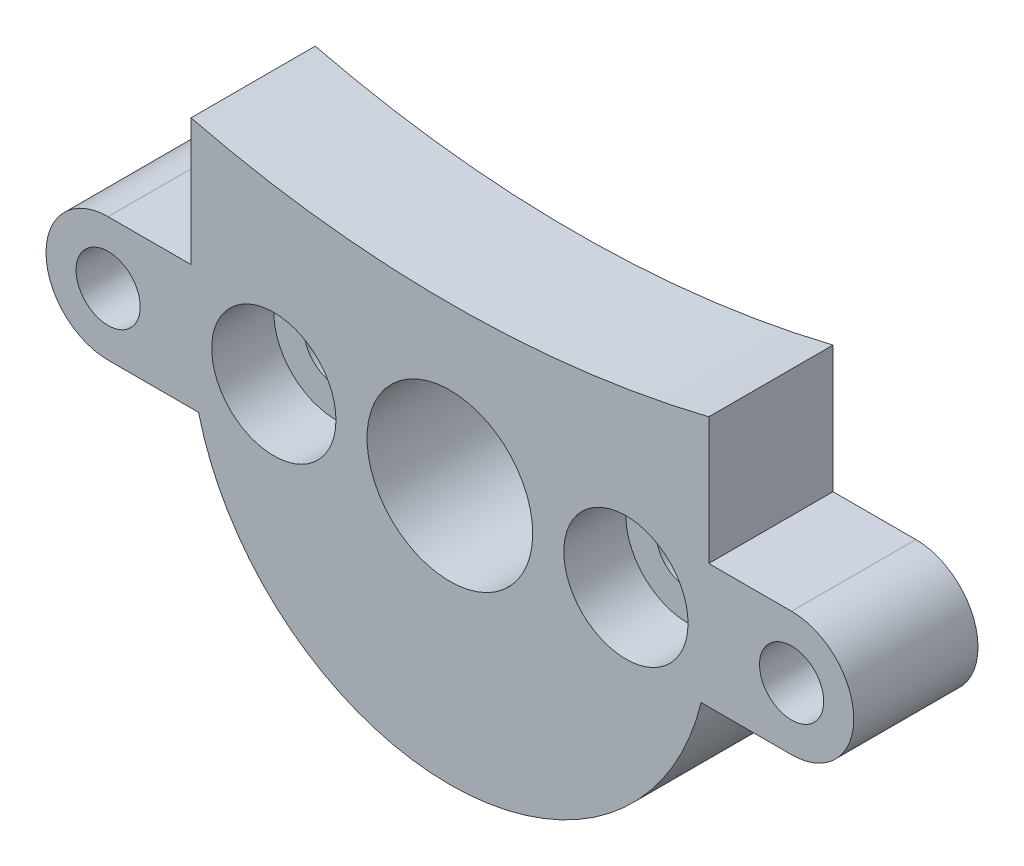
ISO-10303-21;
HEADER;
FILE_DESCRIPTION(('STEP AP214'),'2;1');
FILE_NAME('part.step','',(''),(''),'','','');
FILE_SCHEMA(('AUTOMOTIVE_DESIGN { 1 0 10303 214 1 1 1 1 }'));
ENDSEC;
DATA;
#1=APPLICATION_CONTEXT('core data for automotive mechanical design processes');
#2=APPLICATION_PROTOCOL_DEFINITION('international standard','automotive_design',2000,#1);
#3=PRODUCT_CONTEXT('',#1,'mechanical');
#4=PRODUCT('Part','Part','',(#3));
#5=PRODUCT_RELATED_PRODUCT_CATEGORY('part','',(#4));
#6=PRODUCT_DEFINITION_FORMATION('','',#4);
#7=PRODUCT_DEFINITION_CONTEXT('part definition',#1,'design');
#8=PRODUCT_DEFINITION('design','',#6,#7);
#9=PRODUCT_DEFINITION_SHAPE('','',#8);
#10=(LENGTH_UNIT() NAMED_UNIT(*) SI_UNIT(.MILLI.,.METRE.));
#11=(NAMED_UNIT(*) PLANE_ANGLE_UNIT() SI_UNIT($,.RADIAN.));
#12=(NAMED_UNIT(*) SI_UNIT($,.STERADIAN.) SOLID_ANGLE_UNIT());
#13=UNCERTAINTY_MEASURE_WITH_UNIT(LENGTH_MEASURE(1.E-05),#10,'distance_accuracy_value','');
#14=(GEOMETRIC_REPRESENTATION_CONTEXT(3) GLOBAL_UNCERTAINTY_ASSIGNED_CONTEXT((#13)) GLOBAL_UNIT_ASSIGNED_CONTEXT((#10,
#11,#12)) REPRESENTATION_CONTEXT('',''));
#15=CARTESIAN_POINT('',(0.,0.,0.));
#16=DIRECTION('',(0.,0.,1.));
#17=DIRECTION('',(1.,0.,0.));
#18=AXIS2_PLACEMENT_3D('',#15,#16,#17);
#19=CARTESIAN_POINT('',(-8.5,0.,6.));
#20=DIRECTION('',(0.,0.,-1.));
#21=DIRECTION('',(-1.,0.,0.));
#22=AXIS2_PLACEMENT_3D('',#19,#20,#21);
#23=CYLINDRICAL_SURFACE('',#22,1.55);
#24=CARTESIAN_POINT('',(-8.5,0.,0.));
#25=DIRECTION('',(0.,0.,1.));
#26=DIRECTION('',(1.,0.,0.));
#27=AXIS2_PLACEMENT_3D('',#24,#25,#26);
#28=CIRCLE('',#27,1.55);
#29=CARTESIAN_POINT('',(-6.95,0.,0.));
#30=VERTEX_POINT('',#29);
#31=EDGE_CURVE('E154',#30,#30,#28,.T.);
#32=ORIENTED_EDGE('',*,*,#31,.F.);
#33=EDGE_LOOP('',(#32));
#34=FACE_BOUND('',#33,.T.);
#35=CARTESIAN_POINT('',(-8.5,0.,3.));
#36=DIRECTION('',(0.,0.,1.));
#37=DIRECTION('',(1.,0.,0.));
#38=AXIS2_PLACEMENT_3D('',#35,#36,#37);
#39=CIRCLE('',#38,1.55);
#40=CARTESIAN_POINT('',(-6.95,0.,3.));
#41=VERTEX_POINT('',#40);
#42=EDGE_CURVE('E42',#41,#41,#39,.T.);
#43=ORIENTED_EDGE('',*,*,#42,.T.);
#44=EDGE_LOOP('',(#43));
#45=FACE_BOUND('',#44,.T.);
#46=ADVANCED_FACE('F38',(#34,#45),#23,.F.);
#47=CARTESIAN_POINT('',(8.5,0.,6.));
#48=DIRECTION('',(0.,0.,-1.));
#49=DIRECTION('',(-1.,0.,0.));
#50=AXIS2_PLACEMENT_3D('',#47,#48,#49);
#51=CYLINDRICAL_SURFACE('',#50,1.55);
#52=CARTESIAN_POINT('',(8.5,0.,0.));
#53=DIRECTION('',(0.,0.,1.));
#54=DIRECTION('',(1.,0.,0.));
#55=AXIS2_PLACEMENT_3D('',#52,#53,#54);
#56=CIRCLE('',#55,1.55);
#57=CARTESIAN_POINT('',(10.05,0.,0.));
#58=VERTEX_POINT('',#57);
#59=EDGE_CURVE('E222',#58,#58,#56,.T.);
#60=ORIENTED_EDGE('',*,*,#59,.F.);
#61=EDGE_LOOP('',(#60));
#62=FACE_BOUND('',#61,.T.);
#63=CARTESIAN_POINT('',(8.5,0.,3.));
#64=DIRECTION('',(0.,0.,1.));
#65=DIRECTION('',(1.,0.,0.));
#66=AXIS2_PLACEMENT_3D('',#63,#64,#65);
#67=CIRCLE('',#66,1.55);
#68=CARTESIAN_POINT('',(10.05,0.,3.));
#69=VERTEX_POINT('',#68);
#70=EDGE_CURVE('E186',#69,#69,#67,.T.);
#71=ORIENTED_EDGE('',*,*,#70,.T.);
#72=EDGE_LOOP('',(#71));
#73=FACE_BOUND('',#72,.T.);
#74=ADVANCED_FACE('F270',(#62,#73),#51,.F.);
#75=CARTESIAN_POINT('',(0.,60.0000000000008,6.));
#76=DIRECTION('',(0.,0.,1.));
#77=DIRECTION('',(1.,0.,0.));
#78=AXIS2_PLACEMENT_3D('',#75,#76,#77);
#79=PLANE('',#78);
#80=CARTESIAN_POINT('',(-8.5,0.,6.));
#81=DIRECTION('',(0.,0.,1.));
#82=DIRECTION('',(1.,0.,0.));
#83=AXIS2_PLACEMENT_3D('',#80,#81,#82);
#84=CIRCLE('',#83,3.);
#85=CARTESIAN_POINT('',(-5.5,0.,6.));
#86=VERTEX_POINT('',#85);
#87=EDGE_CURVE('E194',#86,#86,#84,.T.);
#88=ORIENTED_EDGE('',*,*,#87,.F.);
#89=EDGE_LOOP('',(#88));
#90=FACE_BOUND('',#89,.T.);
#91=CARTESIAN_POINT('',(8.5,0.,6.));
#92=DIRECTION('',(0.,0.,1.));
#93=DIRECTION('',(1.,0.,0.));
#94=AXIS2_PLACEMENT_3D('',#91,#92,#93);
#95=CIRCLE('',#94,3.);
#96=CARTESIAN_POINT('',(11.5,0.,6.));
#97=VERTEX_POINT('',#96);
#98=EDGE_CURVE('E204',#97,#97,#95,.T.);
#99=ORIENTED_EDGE('',*,*,#98,.F.);
#100=EDGE_LOOP('',(#99));
#101=FACE_BOUND('',#100,.T.);
#102=CARTESIAN_POINT('',(-16.5,0.,6.));
#103=DIRECTION('',(0.,0.,1.));
#104=DIRECTION('',(1.,0.,0.));
#105=AXIS2_PLACEMENT_3D('',#102,#103,#104);
#106=CIRCLE('',#105,1.55);
#107=CARTESIAN_POINT('',(-14.95,0.,6.));
#108=VERTEX_POINT('',#107);
#109=EDGE_CURVE('E213',#108,#108,#106,.T.);
#110=ORIENTED_EDGE('',*,*,#109,.F.);
#111=EDGE_LOOP('',(#110));
#112=FACE_BOUND('',#111,.T.);
#113=CARTESIAN_POINT('',(0.,60.0000000000008,6.));
#114=DIRECTION('',(0.,0.,-1.));
#115=DIRECTION('',(1.,0.,0.));
#116=AXIS2_PLACEMENT_3D('',#113,#114,#115);
#117=CIRCLE('',#116,52.3808170993934);
#118=CARTESIAN_POINT('',(12.5,9.13252512656031,6.));
#119=VERTEX_POINT('',#118);
#120=CARTESIAN_POINT('',(-12.5,9.13252512656031,6.));
#121=VERTEX_POINT('',#120);
#122=EDGE_CURVE('E169',#119,#121,#117,.T.);
#123=ORIENTED_EDGE('',*,*,#122,.T.);
#124=DIRECTION('',(0.,-1.,0.));
#125=VECTOR('',#124,1.);
#126=CARTESIAN_POINT('',(-12.5,9.13252512656031,6.));
#127=LINE('',#126,#125);
#128=CARTESIAN_POINT('',(-12.5,3.,6.));
#129=VERTEX_POINT('',#128);
#130=EDGE_CURVE('E106',#121,#129,#127,.T.);
#131=ORIENTED_EDGE('',*,*,#130,.T.);
#132=DIRECTION('',(-1.,0.,0.));
#133=VECTOR('',#132,1.);
#134=CARTESIAN_POINT('',(-16.5,3.,6.));
#135=LINE('',#134,#133);
#136=CARTESIAN_POINT('',(-16.5,3.,6.));
#137=VERTEX_POINT('',#136);
#138=EDGE_CURVE('E231',#129,#137,#135,.T.);
#139=ORIENTED_EDGE('',*,*,#138,.T.);
#140=CARTESIAN_POINT('',(-16.5,0.,6.));
#141=DIRECTION('',(0.,0.,1.));
#142=DIRECTION('',(1.,0.,0.));
#143=AXIS2_PLACEMENT_3D('',#140,#141,#142);
#144=CIRCLE('',#143,3.);
#145=CARTESIAN_POINT('',(-16.5,-3.,6.));
#146=VERTEX_POINT('',#145);
#147=EDGE_CURVE('E233',#137,#146,#144,.T.);
#148=ORIENTED_EDGE('',*,*,#147,.T.);
#149=DIRECTION('',(1.,0.,0.));
#150=VECTOR('',#149,1.);
#151=CARTESIAN_POINT('',(-16.5,-3.,6.));
#152=LINE('',#151,#150);
#153=CARTESIAN_POINT('',(-12.1346610995116,-3.,6.));
#154=VERTEX_POINT('',#153);
#155=EDGE_CURVE('E235',#146,#154,#152,.T.);
#156=ORIENTED_EDGE('',*,*,#155,.T.);
#157=CARTESIAN_POINT('',(0.,0.,6.));
#158=DIRECTION('',(0.,0.,1.));
#159=DIRECTION('',(1.,0.,0.));
#160=AXIS2_PLACEMENT_3D('',#157,#158,#159);
#161=CIRCLE('',#160,12.5);
#162=CARTESIAN_POINT('',(12.1346610995116,-3.,6.));
#163=VERTEX_POINT('',#162);
#164=EDGE_CURVE('E237',#154,#163,#161,.T.);
#165=ORIENTED_EDGE('',*,*,#164,.T.);
#166=DIRECTION('',(1.,0.,0.));
#167=VECTOR('',#166,1.);
#168=CARTESIAN_POINT('',(16.5,-3.,6.));
#169=LINE('',#168,#167);
#170=CARTESIAN_POINT('',(16.5,-3.,6.));
#171=VERTEX_POINT('',#170);
#172=EDGE_CURVE('E132',#163,#171,#169,.T.);
#173=ORIENTED_EDGE('',*,*,#172,.T.);
#174=CARTESIAN_POINT('',(16.5,0.,6.));
#175=DIRECTION('',(0.,0.,1.));
#176=DIRECTION('',(-1.,0.,0.));
#177=AXIS2_PLACEMENT_3D('',#174,#175,#176);
#178=CIRCLE('',#177,3.);
#179=CARTESIAN_POINT('',(16.5,3.,6.));
#180=VERTEX_POINT('',#179);
#181=EDGE_CURVE('E125',#171,#180,#178,.T.);
#182=ORIENTED_EDGE('',*,*,#181,.T.);
#183=DIRECTION('',(-1.,0.,0.));
#184=VECTOR('',#183,1.);
#185=CARTESIAN_POINT('',(16.5,3.,6.));
#186=LINE('',#185,#184);
#187=CARTESIAN_POINT('',(12.5,3.,6.));
#188=VERTEX_POINT('',#187);
#189=EDGE_CURVE('E130',#180,#188,#186,.T.);
#190=ORIENTED_EDGE('',*,*,#189,.T.);
#191=DIRECTION('',(0.,1.,0.));
#192=VECTOR('',#191,1.);
#193=CARTESIAN_POINT('',(12.5,3.,6.));
#194=LINE('',#193,#192);
#195=EDGE_CURVE('E57',#188,#119,#194,.T.);
#196=ORIENTED_EDGE('',*,*,#195,.T.);
#197=EDGE_LOOP('',(#123,#131,#139,#148,#156,#165,#173,#182,#190,#196));
#198=FACE_BOUND('',#197,.T.);
#199=CARTESIAN_POINT('',(16.5,0.,6.));
#200=DIRECTION('',(0.,0.,1.));
#201=DIRECTION('',(1.,0.,0.));
#202=AXIS2_PLACEMENT_3D('',#199,#200,#201);
#203=CIRCLE('',#202,1.55);
#204=CARTESIAN_POINT('',(18.05,0.,6.));
#205=VERTEX_POINT('',#204);
#206=EDGE_CURVE('E219',#205,#205,#203,.T.);
#207=ORIENTED_EDGE('',*,*,#206,.F.);
#208=EDGE_LOOP('',(#207));
#209=FACE_BOUND('',#208,.T.);
#210=CARTESIAN_POINT('',(0.,0.,6.));
#211=DIRECTION('',(0.,0.,1.));
#212=DIRECTION('',(1.,0.,0.));
#213=AXIS2_PLACEMENT_3D('',#210,#211,#212);
#214=CIRCLE('',#213,4.);
#215=CARTESIAN_POINT('',(4.,0.,6.));
#216=VERTEX_POINT('',#215);
#217=EDGE_CURVE('E207',#216,#216,#214,.T.);
#218=ORIENTED_EDGE('',*,*,#217,.F.);
#219=EDGE_LOOP('',(#218));
#220=FACE_BOUND('',#219,.T.);
#221=ADVANCED_FACE('F127',(#90,#101,#112,#198,#209,#220),#79,.T.);
#222=CARTESIAN_POINT('',(0.,60.0000000000008,0.));
#223=DIRECTION('',(0.,0.,1.));
#224=DIRECTION('',(1.,0.,0.));
#225=AXIS2_PLACEMENT_3D('',#222,#223,#224);
#226=PLANE('',#225);
#227=CARTESIAN_POINT('',(0.,60.0000000000008,0.));
#228=DIRECTION('',(0.,0.,-1.));
#229=DIRECTION('',(1.,0.,0.));
#230=AXIS2_PLACEMENT_3D('',#227,#228,#229);
#231=CIRCLE('',#230,52.3808170993934);
#232=CARTESIAN_POINT('',(12.5,9.13252512656031,0.));
#233=VERTEX_POINT('',#232);
#234=CARTESIAN_POINT('',(-12.5,9.13252512656031,0.));
#235=VERTEX_POINT('',#234);
#236=EDGE_CURVE('E150',#233,#235,#231,.T.);
#237=ORIENTED_EDGE('',*,*,#236,.F.);
#238=DIRECTION('',(0.,1.,0.));
#239=VECTOR('',#238,1.);
#240=CARTESIAN_POINT('',(12.5,3.,0.));
#241=LINE('',#240,#239);
#242=CARTESIAN_POINT('',(12.5,3.,0.));
#243=VERTEX_POINT('',#242);
#244=EDGE_CURVE('E98',#243,#233,#241,.T.);
#245=ORIENTED_EDGE('',*,*,#244,.F.);
#246=DIRECTION('',(-1.,0.,0.));
#247=VECTOR('',#246,1.);
#248=CARTESIAN_POINT('',(16.5,3.,0.));
#249=LINE('',#248,#247);
#250=CARTESIAN_POINT('',(16.5,3.,0.));
#251=VERTEX_POINT('',#250);
#252=EDGE_CURVE('E92',#251,#243,#249,.T.);
#253=ORIENTED_EDGE('',*,*,#252,.F.);
#254=CARTESIAN_POINT('',(16.5,0.,0.));
#255=DIRECTION('',(0.,0.,1.));
#256=DIRECTION('',(-1.,0.,0.));
#257=AXIS2_PLACEMENT_3D('',#254,#255,#256);
#258=CIRCLE('',#257,3.);
#259=CARTESIAN_POINT('',(16.5,-3.,0.));
#260=VERTEX_POINT('',#259);
#261=EDGE_CURVE('E140',#260,#251,#258,.T.);
#262=ORIENTED_EDGE('',*,*,#261,.F.);
#263=DIRECTION('',(1.,0.,0.));
#264=VECTOR('',#263,1.);
#265=CARTESIAN_POINT('',(16.5,-3.,0.));
#266=LINE('',#265,#264);
#267=CARTESIAN_POINT('',(12.1346610995116,-3.,0.));
#268=VERTEX_POINT('',#267);
#269=EDGE_CURVE('E164',#268,#260,#266,.T.);
#270=ORIENTED_EDGE('',*,*,#269,.F.);
#271=CARTESIAN_POINT('',(0.,0.,0.));
#272=DIRECTION('',(0.,0.,1.));
#273=DIRECTION('',(1.,0.,0.));
#274=AXIS2_PLACEMENT_3D('',#271,#272,#273);
#275=CIRCLE('',#274,12.5);
#276=CARTESIAN_POINT('',(-12.1346610995116,-3.,0.));
#277=VERTEX_POINT('',#276);
#278=EDGE_CURVE('E162',#277,#268,#275,.T.);
#279=ORIENTED_EDGE('',*,*,#278,.F.);
#280=DIRECTION('',(1.,0.,0.));
#281=VECTOR('',#280,1.);
#282=CARTESIAN_POINT('',(-16.5,-3.,0.));
#283=LINE('',#282,#281);
#284=CARTESIAN_POINT('',(-16.5,-3.,0.));
#285=VERTEX_POINT('',#284);
#286=EDGE_CURVE('E160',#285,#277,#283,.T.);
#287=ORIENTED_EDGE('',*,*,#286,.F.);
#288=CARTESIAN_POINT('',(-16.5,0.,0.));
#289=DIRECTION('',(0.,0.,1.));
#290=DIRECTION('',(1.,0.,0.));
#291=AXIS2_PLACEMENT_3D('',#288,#289,#290);
#292=CIRCLE('',#291,3.);
#293=CARTESIAN_POINT('',(-16.5,3.,0.));
#294=VERTEX_POINT('',#293);
#295=EDGE_CURVE('E158',#294,#285,#292,.T.);
#296=ORIENTED_EDGE('',*,*,#295,.F.);
#297=DIRECTION('',(-1.,0.,0.));
#298=VECTOR('',#297,1.);
#299=CARTESIAN_POINT('',(-16.5,3.,0.));
#300=LINE('',#299,#298);
#301=CARTESIAN_POINT('',(-12.5,3.,0.));
#302=VERTEX_POINT('',#301);
#303=EDGE_CURVE('E156',#302,#294,#300,.T.);
#304=ORIENTED_EDGE('',*,*,#303,.F.);
#305=DIRECTION('',(0.,-1.,0.));
#306=VECTOR('',#305,1.);
#307=CARTESIAN_POINT('',(-12.5,9.13252512656031,0.));
#308=LINE('',#307,#306);
#309=EDGE_CURVE('E153',#235,#302,#308,.T.);
#310=ORIENTED_EDGE('',*,*,#309,.F.);
#311=EDGE_LOOP('',(#237,#245,#253,#262,#270,#279,#287,#296,#304,#310));
#312=FACE_BOUND('',#311,.T.);
#313=ORIENTED_EDGE('',*,*,#31,.T.);
#314=EDGE_LOOP('',(#313));
#315=FACE_BOUND('',#314,.T.);
#316=ORIENTED_EDGE('',*,*,#59,.T.);
#317=EDGE_LOOP('',(#316));
#318=FACE_BOUND('',#317,.T.);
#319=CARTESIAN_POINT('',(16.5,0.,0.));
#320=DIRECTION('',(0.,0.,1.));
#321=DIRECTION('',(1.,0.,0.));
#322=AXIS2_PLACEMENT_3D('',#319,#320,#321);
#323=CIRCLE('',#322,1.55);
#324=CARTESIAN_POINT('',(18.05,0.,0.));
#325=VERTEX_POINT('',#324);
#326=EDGE_CURVE('E216',#325,#325,#323,.T.);
#327=ORIENTED_EDGE('',*,*,#326,.T.);
#328=EDGE_LOOP('',(#327));
#329=FACE_BOUND('',#328,.T.);
#330=CARTESIAN_POINT('',(-16.5,0.,0.));
#331=DIRECTION('',(0.,0.,1.));
#332=DIRECTION('',(1.,0.,0.));
#333=AXIS2_PLACEMENT_3D('',#330,#331,#332);
#334=CIRCLE('',#333,1.55);
#335=CARTESIAN_POINT('',(-14.95,0.,0.));
#336=VERTEX_POINT('',#335);
#337=EDGE_CURVE('E210',#336,#336,#334,.T.);
#338=ORIENTED_EDGE('',*,*,#337,.T.);
#339=EDGE_LOOP('',(#338));
#340=FACE_BOUND('',#339,.T.);
#341=CARTESIAN_POINT('',(0.,0.,0.));
#342=DIRECTION('',(0.,0.,1.));
#343=DIRECTION('',(1.,0.,0.));
#344=AXIS2_PLACEMENT_3D('',#341,#342,#343);
#345=CIRCLE('',#344,4.);
#346=CARTESIAN_POINT('',(4.,0.,0.));
#347=VERTEX_POINT('',#346);
#348=EDGE_CURVE('E192',#347,#347,#345,.T.);
#349=ORIENTED_EDGE('',*,*,#348,.T.);
#350=EDGE_LOOP('',(#349));
#351=FACE_BOUND('',#350,.T.);
#352=ADVANCED_FACE('F250',(#312,#315,#318,#329,#340,#351),#226,.F.);
#353=CARTESIAN_POINT('',(0.,60.0000000000008,6.));
#354=DIRECTION('',(0.,0.,-1.));
#355=DIRECTION('',(-1.,0.,0.));
#356=AXIS2_PLACEMENT_3D('',#353,#354,#355);
#357=CYLINDRICAL_SURFACE('',#356,52.3808170993934);
#358=ORIENTED_EDGE('',*,*,#236,.T.);
#359=DIRECTION('',(0.,0.,-1.));
#360=VECTOR('',#359,1.);
#361=CARTESIAN_POINT('',(-12.5,9.13252512656031,6.));
#362=LINE('',#361,#360);
#363=EDGE_CURVE('E11',#121,#235,#362,.T.);
#364=ORIENTED_EDGE('',*,*,#363,.F.);
#365=ORIENTED_EDGE('',*,*,#122,.F.);
#366=DIRECTION('',(0.,0.,-1.));
#367=VECTOR('',#366,1.);
#368=CARTESIAN_POINT('',(12.5,9.13252512656031,6.));
#369=LINE('',#368,#367);
#370=EDGE_CURVE('E146',#119,#233,#369,.T.);
#371=ORIENTED_EDGE('',*,*,#370,.T.);
#372=EDGE_LOOP('',(#358,#364,#365,#371));
#373=FACE_BOUND('',#372,.T.);
#374=ADVANCED_FACE('F40',(#373),#357,.F.);
#375=CARTESIAN_POINT('',(-12.5,9.13252512656031,6.));
#376=DIRECTION('',(1.,0.,0.));
#377=DIRECTION('',(0.,0.,-1.));
#378=AXIS2_PLACEMENT_3D('',#375,#376,#377);
#379=PLANE('',#378);
#380=ORIENTED_EDGE('',*,*,#309,.T.);
#381=DIRECTION('',(0.,0.,-1.));
#382=VECTOR('',#381,1.);
#383=CARTESIAN_POINT('',(-12.5,3.,6.));
#384=LINE('',#383,#382);
#385=EDGE_CURVE('E48',#129,#302,#384,.T.);
#386=ORIENTED_EDGE('',*,*,#385,.F.);
#387=ORIENTED_EDGE('',*,*,#130,.F.);
#388=ORIENTED_EDGE('',*,*,#363,.T.);
#389=EDGE_LOOP('',(#380,#386,#387,#388));
#390=FACE_BOUND('',#389,.T.);
#391=ADVANCED_FACE('F287',(#390),#379,.F.);
#392=CARTESIAN_POINT('',(-16.5,3.,6.));
#393=DIRECTION('',(0.,-1.,0.));
#394=DIRECTION('',(0.,0.,-1.));
#395=AXIS2_PLACEMENT_3D('',#392,#393,#394);
#396=PLANE('',#395);
#397=ORIENTED_EDGE('',*,*,#303,.T.);
#398=DIRECTION('',(0.,0.,-1.));
#399=VECTOR('',#398,1.);
#400=CARTESIAN_POINT('',(-16.5,3.,6.));
#401=LINE('',#400,#399);
#402=EDGE_CURVE('E182',#137,#294,#401,.T.);
#403=ORIENTED_EDGE('',*,*,#402,.F.);
#404=ORIENTED_EDGE('',*,*,#138,.F.);
#405=ORIENTED_EDGE('',*,*,#385,.T.);
#406=EDGE_LOOP('',(#397,#403,#404,#405));
#407=FACE_BOUND('',#406,.T.);
#408=ADVANCED_FACE('F291',(#407),#396,.F.);
#409=CARTESIAN_POINT('',(-16.5,0.,6.));
#410=DIRECTION('',(0.,0.,-1.));
#411=DIRECTION('',(-1.,0.,0.));
#412=AXIS2_PLACEMENT_3D('',#409,#410,#411);
#413=CYLINDRICAL_SURFACE('',#412,3.);
#414=ORIENTED_EDGE('',*,*,#295,.T.);
#415=DIRECTION('',(0.,0.,-1.));
#416=VECTOR('',#415,1.);
#417=CARTESIAN_POINT('',(-16.5,-3.,6.));
#418=LINE('',#417,#416);
#419=EDGE_CURVE('E179',#146,#285,#418,.T.);
#420=ORIENTED_EDGE('',*,*,#419,.F.);
#421=ORIENTED_EDGE('',*,*,#147,.F.);
#422=ORIENTED_EDGE('',*,*,#402,.T.);
#423=EDGE_LOOP('',(#414,#420,#421,#422));
#424=FACE_BOUND('',#423,.T.);
#425=ADVANCED_FACE('F295',(#424),#413,.T.);
#426=CARTESIAN_POINT('',(-16.5,-3.,6.));
#427=DIRECTION('',(0.,1.,0.));
#428=DIRECTION('',(0.,0.,1.));
#429=AXIS2_PLACEMENT_3D('',#426,#427,#428);
#430=PLANE('',#429);
#431=ORIENTED_EDGE('',*,*,#286,.T.);
#432=DIRECTION('',(0.,0.,-1.));
#433=VECTOR('',#432,1.);
#434=CARTESIAN_POINT('',(-12.1346610995116,-3.,6.));
#435=LINE('',#434,#433);
#436=EDGE_CURVE('E176',#154,#277,#435,.T.);
#437=ORIENTED_EDGE('',*,*,#436,.F.);
#438=ORIENTED_EDGE('',*,*,#155,.F.);
#439=ORIENTED_EDGE('',*,*,#419,.T.);
#440=EDGE_LOOP('',(#431,#437,#438,#439));
#441=FACE_BOUND('',#440,.T.);
#442=ADVANCED_FACE('F301',(#441),#430,.F.);
#443=CARTESIAN_POINT('',(0.,0.,6.));
#444=DIRECTION('',(0.,0.,-1.));
#445=DIRECTION('',(-1.,0.,0.));
#446=AXIS2_PLACEMENT_3D('',#443,#444,#445);
#447=CYLINDRICAL_SURFACE('',#446,12.5);
#448=ORIENTED_EDGE('',*,*,#278,.T.);
#449=DIRECTION('',(0.,0.,-1.));
#450=VECTOR('',#449,1.);
#451=CARTESIAN_POINT('',(12.1346610995116,-3.,6.));
#452=LINE('',#451,#450);
#453=EDGE_CURVE('E173',#163,#268,#452,.T.);
#454=ORIENTED_EDGE('',*,*,#453,.F.);
#455=ORIENTED_EDGE('',*,*,#164,.F.);
#456=ORIENTED_EDGE('',*,*,#436,.T.);
#457=EDGE_LOOP('',(#448,#454,#455,#456));
#458=FACE_BOUND('',#457,.T.);
#459=ADVANCED_FACE('F243',(#458),#447,.T.);
#460=CARTESIAN_POINT('',(16.5,-3.,6.));
#461=DIRECTION('',(0.,1.,0.));
#462=DIRECTION('',(0.,0.,1.));
#463=AXIS2_PLACEMENT_3D('',#460,#461,#462);
#464=PLANE('',#463);
#465=ORIENTED_EDGE('',*,*,#269,.T.);
#466=DIRECTION('',(0.,0.,-1.));
#467=VECTOR('',#466,1.);
#468=CARTESIAN_POINT('',(16.5,-3.,6.));
#469=LINE('',#468,#467);
#470=EDGE_CURVE('E141',#171,#260,#469,.T.);
#471=ORIENTED_EDGE('',*,*,#470,.F.);
#472=ORIENTED_EDGE('',*,*,#172,.F.);
#473=ORIENTED_EDGE('',*,*,#453,.T.);
#474=EDGE_LOOP('',(#465,#471,#472,#473));
#475=FACE_BOUND('',#474,.T.);
#476=ADVANCED_FACE('F247',(#475),#464,.F.);
#477=CARTESIAN_POINT('',(16.5,0.,6.));
#478=DIRECTION('',(0.,0.,-1.));
#479=DIRECTION('',(-1.,0.,0.));
#480=AXIS2_PLACEMENT_3D('',#477,#478,#479);
#481=CYLINDRICAL_SURFACE('',#480,3.);
#482=ORIENTED_EDGE('',*,*,#261,.T.);
#483=DIRECTION('',(0.,0.,-1.));
#484=VECTOR('',#483,1.);
#485=CARTESIAN_POINT('',(16.5,3.,6.));
#486=LINE('',#485,#484);
#487=EDGE_CURVE('E137',#180,#251,#486,.T.);
#488=ORIENTED_EDGE('',*,*,#487,.F.);
#489=ORIENTED_EDGE('',*,*,#181,.F.);
#490=ORIENTED_EDGE('',*,*,#470,.T.);
#491=EDGE_LOOP('',(#482,#488,#489,#490));
#492=FACE_BOUND('',#491,.T.);
#493=ADVANCED_FACE('F138',(#492),#481,.T.);
#494=CARTESIAN_POINT('',(16.5,3.,6.));
#495=DIRECTION('',(0.,-1.,0.));
#496=DIRECTION('',(0.,0.,-1.));
#497=AXIS2_PLACEMENT_3D('',#494,#495,#496);
#498=PLANE('',#497);
#499=ORIENTED_EDGE('',*,*,#252,.T.);
#500=DIRECTION('',(0.,0.,-1.));
#501=VECTOR('',#500,1.);
#502=CARTESIAN_POINT('',(12.5,3.,6.));
#503=LINE('',#502,#501);
#504=EDGE_CURVE('E142',#188,#243,#503,.T.);
#505=ORIENTED_EDGE('',*,*,#504,.F.);
#506=ORIENTED_EDGE('',*,*,#189,.F.);
#507=ORIENTED_EDGE('',*,*,#487,.T.);
#508=EDGE_LOOP('',(#499,#505,#506,#507));
#509=FACE_BOUND('',#508,.T.);
#510=ADVANCED_FACE('F144',(#509),#498,.F.);
#511=CARTESIAN_POINT('',(12.5,3.,6.));
#512=DIRECTION('',(-1.,0.,0.));
#513=DIRECTION('',(0.,0.,1.));
#514=AXIS2_PLACEMENT_3D('',#511,#512,#513);
#515=PLANE('',#514);
#516=ORIENTED_EDGE('',*,*,#244,.T.);
#517=ORIENTED_EDGE('',*,*,#370,.F.);
#518=ORIENTED_EDGE('',*,*,#195,.F.);
#519=ORIENTED_EDGE('',*,*,#504,.T.);
#520=EDGE_LOOP('',(#516,#517,#518,#519));
#521=FACE_BOUND('',#520,.T.);
#522=ADVANCED_FACE('F256',(#521),#515,.F.);
#523=CARTESIAN_POINT('',(16.5,0.,6.));
#524=DIRECTION('',(0.,0.,-1.));
#525=DIRECTION('',(-1.,0.,0.));
#526=AXIS2_PLACEMENT_3D('',#523,#524,#525);
#527=CYLINDRICAL_SURFACE('',#526,1.55);
#528=ORIENTED_EDGE('',*,*,#206,.T.);
#529=EDGE_LOOP('',(#528));
#530=FACE_BOUND('',#529,.T.);
#531=ORIENTED_EDGE('',*,*,#326,.F.);
#532=EDGE_LOOP('',(#531));
#533=FACE_BOUND('',#532,.T.);
#534=ADVANCED_FACE('F258',(#530,#533),#527,.F.);
#535=CARTESIAN_POINT('',(-16.5,0.,6.));
#536=DIRECTION('',(0.,0.,-1.));
#537=DIRECTION('',(-1.,0.,0.));
#538=AXIS2_PLACEMENT_3D('',#535,#536,#537);
#539=CYLINDRICAL_SURFACE('',#538,1.55);
#540=ORIENTED_EDGE('',*,*,#109,.T.);
#541=EDGE_LOOP('',(#540));
#542=FACE_BOUND('',#541,.T.);
#543=ORIENTED_EDGE('',*,*,#337,.F.);
#544=EDGE_LOOP('',(#543));
#545=FACE_BOUND('',#544,.T.);
#546=ADVANCED_FACE('F264',(#542,#545),#539,.F.);
#547=CARTESIAN_POINT('',(0.,0.,6.));
#548=DIRECTION('',(0.,0.,-1.));
#549=DIRECTION('',(-1.,0.,0.));
#550=AXIS2_PLACEMENT_3D('',#547,#548,#549);
#551=CYLINDRICAL_SURFACE('',#550,4.);
#552=ORIENTED_EDGE('',*,*,#217,.T.);
#553=EDGE_LOOP('',(#552));
#554=FACE_BOUND('',#553,.T.);
#555=ORIENTED_EDGE('',*,*,#348,.F.);
#556=EDGE_LOOP('',(#555));
#557=FACE_BOUND('',#556,.T.);
#558=ADVANCED_FACE('F338',(#554,#557),#551,.F.);
#559=CARTESIAN_POINT('',(8.5,0.,3.));
#560=DIRECTION('',(0.,0.,1.));
#561=DIRECTION('',(1.,0.,0.));
#562=AXIS2_PLACEMENT_3D('',#559,#560,#561);
#563=CYLINDRICAL_SURFACE('',#562,3.);
#564=CARTESIAN_POINT('',(8.5,0.,3.));
#565=DIRECTION('',(0.,0.,1.));
#566=DIRECTION('',(1.,0.,0.));
#567=AXIS2_PLACEMENT_3D('',#564,#565,#566);
#568=CIRCLE('',#567,3.);
#569=CARTESIAN_POINT('',(11.5,0.,3.));
#570=VERTEX_POINT('',#569);
#571=EDGE_CURVE('E199',#570,#570,#568,.T.);
#572=ORIENTED_EDGE('',*,*,#571,.F.);
#573=EDGE_LOOP('',(#572));
#574=FACE_BOUND('',#573,.T.);
#575=ORIENTED_EDGE('',*,*,#98,.T.);
#576=EDGE_LOOP('',(#575));
#577=FACE_BOUND('',#576,.T.);
#578=ADVANCED_FACE('F347',(#574,#577),#563,.F.);
#579=CARTESIAN_POINT('',(8.5,0.,3.));
#580=DIRECTION('',(0.,0.,1.));
#581=DIRECTION('',(1.,0.,0.));
#582=AXIS2_PLACEMENT_3D('',#579,#580,#581);
#583=PLANE('',#582);
#584=ORIENTED_EDGE('',*,*,#70,.F.);
#585=EDGE_LOOP('',(#584));
#586=FACE_BOUND('',#585,.T.);
#587=ORIENTED_EDGE('',*,*,#571,.T.);
#588=EDGE_LOOP('',(#587));
#589=FACE_BOUND('',#588,.T.);
#590=ADVANCED_FACE('F375',(#586,#589),#583,.T.);
#591=CARTESIAN_POINT('',(-8.5,0.,3.));
#592=DIRECTION('',(0.,0.,1.));
#593=DIRECTION('',(1.,0.,0.));
#594=AXIS2_PLACEMENT_3D('',#591,#592,#593);
#595=CYLINDRICAL_SURFACE('',#594,3.);
#596=CARTESIAN_POINT('',(-8.5,0.,3.));
#597=DIRECTION('',(0.,0.,1.));
#598=DIRECTION('',(1.,0.,0.));
#599=AXIS2_PLACEMENT_3D('',#596,#597,#598);
#600=CIRCLE('',#599,3.);
#601=CARTESIAN_POINT('',(-5.5,0.,3.));
#602=VERTEX_POINT('',#601);
#603=EDGE_CURVE('E188',#602,#602,#600,.T.);
#604=ORIENTED_EDGE('',*,*,#603,.F.);
#605=EDGE_LOOP('',(#604));
#606=FACE_BOUND('',#605,.T.);
#607=ORIENTED_EDGE('',*,*,#87,.T.);
#608=EDGE_LOOP('',(#607));
#609=FACE_BOUND('',#608,.T.);
#610=ADVANCED_FACE('F385',(#606,#609),#595,.F.);
#611=CARTESIAN_POINT('',(-8.5,0.,3.));
#612=DIRECTION('',(0.,0.,1.));
#613=DIRECTION('',(1.,0.,0.));
#614=AXIS2_PLACEMENT_3D('',#611,#612,#613);
#615=PLANE('',#614);
#616=ORIENTED_EDGE('',*,*,#42,.F.);
#617=EDGE_LOOP('',(#616));
#618=FACE_BOUND('',#617,.T.);
#619=ORIENTED_EDGE('',*,*,#603,.T.);
#620=EDGE_LOOP('',(#619));
#621=FACE_BOUND('',#620,.T.);
#622=ADVANCED_FACE('F395',(#618,#621),#615,.T.);
#623=CLOSED_SHELL('',(#46,#74,#221,#352,#374,#391,#408,#425,#442,#459,#476,#493,#510,#522,#534,
#546,#558,#578,#590,#610,#622));
#624=MANIFOLD_SOLID_BREP('B2',#623);
#625=ADVANCED_BREP_SHAPE_REPRESENTATION('',(#18,#624),#14);
#626=SHAPE_DEFINITION_REPRESENTATION(#9,#625);
ENDSEC;
END-ISO-10303-21;
